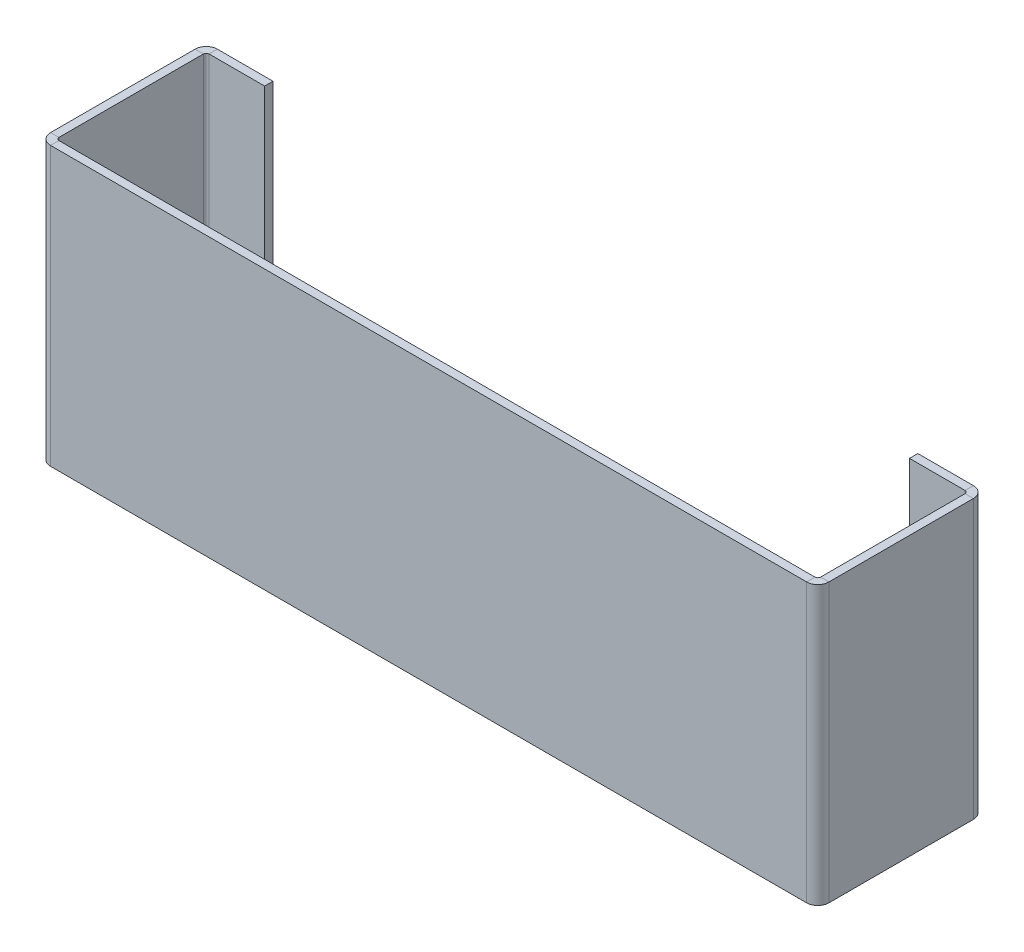
ISO-10303-21;
HEADER;
FILE_DESCRIPTION(('STEP AP214'),'2;1');
FILE_NAME('part.step','',(''),(''),'','','');
FILE_SCHEMA(('AUTOMOTIVE_DESIGN { 1 0 10303 214 1 1 1 1 }'));
ENDSEC;
DATA;
#1=APPLICATION_CONTEXT('core data for automotive mechanical design processes');
#2=APPLICATION_PROTOCOL_DEFINITION('international standard','automotive_design',2000,#1);
#3=PRODUCT_CONTEXT('',#1,'mechanical');
#4=PRODUCT('Part','Part','',(#3));
#5=PRODUCT_RELATED_PRODUCT_CATEGORY('part','',(#4));
#6=PRODUCT_DEFINITION_FORMATION('','',#4);
#7=PRODUCT_DEFINITION_CONTEXT('part definition',#1,'design');
#8=PRODUCT_DEFINITION('design','',#6,#7);
#9=PRODUCT_DEFINITION_SHAPE('','',#8);
#10=(LENGTH_UNIT() NAMED_UNIT(*) SI_UNIT(.MILLI.,.METRE.));
#11=(NAMED_UNIT(*) PLANE_ANGLE_UNIT() SI_UNIT($,.RADIAN.));
#12=(NAMED_UNIT(*) SI_UNIT($,.STERADIAN.) SOLID_ANGLE_UNIT());
#13=UNCERTAINTY_MEASURE_WITH_UNIT(LENGTH_MEASURE(1.E-05),#10,'distance_accuracy_value','');
#14=(GEOMETRIC_REPRESENTATION_CONTEXT(3) GLOBAL_UNCERTAINTY_ASSIGNED_CONTEXT((#13)) GLOBAL_UNIT_ASSIGNED_CONTEXT((#10,
#11,#12)) REPRESENTATION_CONTEXT('',''));
#15=CARTESIAN_POINT('',(0.,0.,0.));
#16=DIRECTION('',(0.,0.,1.));
#17=DIRECTION('',(1.,0.,0.));
#18=AXIS2_PLACEMENT_3D('',#15,#16,#17);
#19=CARTESIAN_POINT('',(-68.,50.,-30.));
#20=DIRECTION('',(0.,1.,0.));
#21=DIRECTION('',(0.,0.,1.));
#22=AXIS2_PLACEMENT_3D('',#19,#20,#21);
#23=PLANE('',#22);
#24=DIRECTION('',(0.,0.,1.));
#25=VECTOR('',#24,1.);
#26=CARTESIAN_POINT('',(-68.,50.,-30.));
#27=LINE('',#26,#25);
#28=CARTESIAN_POINT('',(-68.,50.,-30.));
#29=VERTEX_POINT('',#28);
#30=CARTESIAN_POINT('',(-68.,50.,-28.5));
#31=VERTEX_POINT('',#30);
#32=EDGE_CURVE('E11',#29,#31,#27,.T.);
#33=ORIENTED_EDGE('',*,*,#32,.F.);
#34=CARTESIAN_POINT('',(-68.,50.,-28.));
#35=DIRECTION('',(0.,-1.,0.));
#36=DIRECTION('',(0.,0.,-1.));
#37=AXIS2_PLACEMENT_3D('',#34,#35,#36);
#38=CIRCLE('',#37,2.);
#39=CARTESIAN_POINT('',(-70.,50.,-28.));
#40=VERTEX_POINT('',#39);
#41=EDGE_CURVE('E364',#29,#40,#38,.F.);
#42=ORIENTED_EDGE('',*,*,#41,.T.);
#43=DIRECTION('',(-1.,0.,0.));
#44=VECTOR('',#43,1.);
#45=CARTESIAN_POINT('',(-68.5,50.,-28.));
#46=LINE('',#45,#44);
#47=CARTESIAN_POINT('',(-68.5,50.,-28.));
#48=VERTEX_POINT('',#47);
#49=EDGE_CURVE('E47',#48,#40,#46,.T.);
#50=ORIENTED_EDGE('',*,*,#49,.F.);
#51=CARTESIAN_POINT('',(-68.,50.,-28.));
#52=DIRECTION('',(0.,1.,0.));
#53=DIRECTION('',(1.,0.,0.));
#54=AXIS2_PLACEMENT_3D('',#51,#52,#53);
#55=CIRCLE('',#54,0.5);
#56=EDGE_CURVE('E439',#31,#48,#55,.T.);
#57=ORIENTED_EDGE('',*,*,#56,.F.);
#58=EDGE_LOOP('',(#33,#42,#50,#57));
#59=FACE_BOUND('',#58,.T.);
#60=ADVANCED_FACE('F39',(#59),#23,.T.);
#61=CARTESIAN_POINT('',(-68.5,50.,-28.));
#62=DIRECTION('',(0.,1.,0.));
#63=DIRECTION('',(0.,0.,1.));
#64=AXIS2_PLACEMENT_3D('',#61,#62,#63);
#65=PLANE('',#64);
#66=DIRECTION('',(-1.,0.,0.));
#67=VECTOR('',#66,1.);
#68=CARTESIAN_POINT('',(-70.,50.,-30.));
#69=LINE('',#68,#67);
#70=CARTESIAN_POINT('',(-58.,50.,-30.));
#71=VERTEX_POINT('',#70);
#72=EDGE_CURVE('E368',#71,#29,#69,.T.);
#73=ORIENTED_EDGE('',*,*,#72,.T.);
#74=ORIENTED_EDGE('',*,*,#32,.T.);
#75=DIRECTION('',(-1.,0.,0.));
#76=VECTOR('',#75,1.);
#77=CARTESIAN_POINT('',(-70.,50.,-28.5));
#78=LINE('',#77,#76);
#79=CARTESIAN_POINT('',(-58.,50.,-28.5));
#80=VERTEX_POINT('',#79);
#81=EDGE_CURVE('E441',#80,#31,#78,.T.);
#82=ORIENTED_EDGE('',*,*,#81,.F.);
#83=DIRECTION('',(0.,0.,1.));
#84=VECTOR('',#83,1.);
#85=CARTESIAN_POINT('',(-58.,50.,-30.));
#86=LINE('',#85,#84);
#87=EDGE_CURVE('E444',#71,#80,#86,.T.);
#88=ORIENTED_EDGE('',*,*,#87,.F.);
#89=EDGE_LOOP('',(#73,#74,#82,#88));
#90=FACE_BOUND('',#89,.T.);
#91=ADVANCED_FACE('F450',(#90),#65,.T.);
#92=CARTESIAN_POINT('',(-70.,0.,-28.));
#93=DIRECTION('',(0.,-1.,0.));
#94=DIRECTION('',(0.,0.,-1.));
#95=AXIS2_PLACEMENT_3D('',#92,#93,#94);
#96=PLANE('',#95);
#97=DIRECTION('',(1.,0.,0.));
#98=VECTOR('',#97,1.);
#99=CARTESIAN_POINT('',(-70.,0.,-28.));
#100=LINE('',#99,#98);
#101=CARTESIAN_POINT('',(-70.,0.,-28.));
#102=VERTEX_POINT('',#101);
#103=CARTESIAN_POINT('',(-68.5,0.,-28.));
#104=VERTEX_POINT('',#103);
#105=EDGE_CURVE('E348',#102,#104,#100,.T.);
#106=ORIENTED_EDGE('',*,*,#105,.F.);
#107=CARTESIAN_POINT('',(-68.,0.,-28.));
#108=DIRECTION('',(0.,-1.,0.));
#109=DIRECTION('',(0.,0.,-1.));
#110=AXIS2_PLACEMENT_3D('',#107,#108,#109);
#111=CIRCLE('',#110,2.);
#112=CARTESIAN_POINT('',(-68.,0.,-30.));
#113=VERTEX_POINT('',#112);
#114=EDGE_CURVE('E264',#113,#102,#111,.F.);
#115=ORIENTED_EDGE('',*,*,#114,.F.);
#116=DIRECTION('',(0.,0.,-1.));
#117=VECTOR('',#116,1.);
#118=CARTESIAN_POINT('',(-68.,0.,-28.5));
#119=LINE('',#118,#117);
#120=CARTESIAN_POINT('',(-68.,0.,-28.5));
#121=VERTEX_POINT('',#120);
#122=EDGE_CURVE('E346',#121,#113,#119,.T.);
#123=ORIENTED_EDGE('',*,*,#122,.F.);
#124=CARTESIAN_POINT('',(-68.,0.,-28.));
#125=DIRECTION('',(0.,1.,0.));
#126=DIRECTION('',(1.,0.,0.));
#127=AXIS2_PLACEMENT_3D('',#124,#125,#126);
#128=CIRCLE('',#127,0.5);
#129=EDGE_CURVE('E252',#121,#104,#128,.T.);
#130=ORIENTED_EDGE('',*,*,#129,.T.);
#131=EDGE_LOOP('',(#106,#115,#123,#130));
#132=FACE_BOUND('',#131,.T.);
#133=ADVANCED_FACE('F457',(#132),#96,.T.);
#134=CARTESIAN_POINT('',(-68.,0.,-28.5));
#135=DIRECTION('',(0.,-1.,0.));
#136=DIRECTION('',(0.,0.,-1.));
#137=AXIS2_PLACEMENT_3D('',#134,#135,#136);
#138=PLANE('',#137);
#139=DIRECTION('',(0.,0.,1.));
#140=VECTOR('',#139,1.);
#141=CARTESIAN_POINT('',(-70.,0.,0.));
#142=LINE('',#141,#140);
#143=CARTESIAN_POINT('',(-70.,0.,-1.99999999999999));
#144=VERTEX_POINT('',#143);
#145=EDGE_CURVE('E267',#102,#144,#142,.T.);
#146=ORIENTED_EDGE('',*,*,#145,.F.);
#147=ORIENTED_EDGE('',*,*,#105,.T.);
#148=DIRECTION('',(0.,0.,1.));
#149=VECTOR('',#148,1.);
#150=CARTESIAN_POINT('',(-68.5,0.,0.));
#151=LINE('',#150,#149);
#152=CARTESIAN_POINT('',(-68.5,0.,-1.99999999999999));
#153=VERTEX_POINT('',#152);
#154=EDGE_CURVE('E249',#104,#153,#151,.T.);
#155=ORIENTED_EDGE('',*,*,#154,.T.);
#156=DIRECTION('',(-1.,0.,0.));
#157=VECTOR('',#156,1.);
#158=CARTESIAN_POINT('',(-68.5,0.,-1.99999999999999));
#159=LINE('',#158,#157);
#160=EDGE_CURVE('E338',#153,#144,#159,.T.);
#161=ORIENTED_EDGE('',*,*,#160,.T.);
#162=EDGE_LOOP('',(#146,#147,#155,#161));
#163=FACE_BOUND('',#162,.T.);
#164=ADVANCED_FACE('F460',(#163),#138,.T.);
#165=CARTESIAN_POINT('',(-70.,50.,-1.99999999999999));
#166=DIRECTION('',(0.,1.,0.));
#167=DIRECTION('',(0.,0.,1.));
#168=AXIS2_PLACEMENT_3D('',#165,#166,#167);
#169=PLANE('',#168);
#170=DIRECTION('',(1.,0.,0.));
#171=VECTOR('',#170,1.);
#172=CARTESIAN_POINT('',(-70.,50.,-1.99999999999999));
#173=LINE('',#172,#171);
#174=CARTESIAN_POINT('',(-70.,50.,-1.99999999999999));
#175=VERTEX_POINT('',#174);
#176=CARTESIAN_POINT('',(-68.5,50.,-1.99999999999999));
#177=VERTEX_POINT('',#176);
#178=EDGE_CURVE('E344',#175,#177,#173,.T.);
#179=ORIENTED_EDGE('',*,*,#178,.F.);
#180=CARTESIAN_POINT('',(-68.,50.,-1.99999999999999));
#181=DIRECTION('',(0.,-1.,0.));
#182=DIRECTION('',(0.,0.,-1.));
#183=AXIS2_PLACEMENT_3D('',#180,#181,#182);
#184=CIRCLE('',#183,2.);
#185=CARTESIAN_POINT('',(-68.,50.,0.));
#186=VERTEX_POINT('',#185);
#187=EDGE_CURVE('E376',#175,#186,#184,.F.);
#188=ORIENTED_EDGE('',*,*,#187,.T.);
#189=DIRECTION('',(0.,0.,1.));
#190=VECTOR('',#189,1.);
#191=CARTESIAN_POINT('',(-68.,50.,-1.49999999999999));
#192=LINE('',#191,#190);
#193=CARTESIAN_POINT('',(-68.,50.,-1.49999999999999));
#194=VERTEX_POINT('',#193);
#195=EDGE_CURVE('E342',#194,#186,#192,.T.);
#196=ORIENTED_EDGE('',*,*,#195,.F.);
#197=CARTESIAN_POINT('',(-68.,50.,-1.99999999999999));
#198=DIRECTION('',(0.,1.,0.));
#199=DIRECTION('',(1.,0.,0.));
#200=AXIS2_PLACEMENT_3D('',#197,#198,#199);
#201=CIRCLE('',#200,0.5);
#202=EDGE_CURVE('E435',#177,#194,#201,.T.);
#203=ORIENTED_EDGE('',*,*,#202,.F.);
#204=EDGE_LOOP('',(#179,#188,#196,#203));
#205=FACE_BOUND('',#204,.T.);
#206=ADVANCED_FACE('F480',(#205),#169,.T.);
#207=CARTESIAN_POINT('',(-68.,50.,-1.49999999999999));
#208=DIRECTION('',(0.,1.,0.));
#209=DIRECTION('',(0.,0.,1.));
#210=AXIS2_PLACEMENT_3D('',#207,#208,#209);
#211=PLANE('',#210);
#212=DIRECTION('',(0.,0.,1.));
#213=VECTOR('',#212,1.);
#214=CARTESIAN_POINT('',(-70.,50.,0.));
#215=LINE('',#214,#213);
#216=EDGE_CURVE('E355',#40,#175,#215,.T.);
#217=ORIENTED_EDGE('',*,*,#216,.T.);
#218=ORIENTED_EDGE('',*,*,#178,.T.);
#219=DIRECTION('',(0.,0.,1.));
#220=VECTOR('',#219,1.);
#221=CARTESIAN_POINT('',(-68.5,50.,0.));
#222=LINE('',#221,#220);
#223=EDGE_CURVE('E358',#48,#177,#222,.T.);
#224=ORIENTED_EDGE('',*,*,#223,.F.);
#225=ORIENTED_EDGE('',*,*,#49,.T.);
#226=EDGE_LOOP('',(#217,#218,#224,#225));
#227=FACE_BOUND('',#226,.T.);
#228=ADVANCED_FACE('F353',(#227),#211,.T.);
#229=CARTESIAN_POINT('',(-68.,0.,0.));
#230=DIRECTION('',(0.,-1.,0.));
#231=DIRECTION('',(0.,0.,-1.));
#232=AXIS2_PLACEMENT_3D('',#229,#230,#231);
#233=PLANE('',#232);
#234=DIRECTION('',(0.,0.,-1.));
#235=VECTOR('',#234,1.);
#236=CARTESIAN_POINT('',(-68.,0.,0.));
#237=LINE('',#236,#235);
#238=CARTESIAN_POINT('',(-68.,0.,0.));
#239=VERTEX_POINT('',#238);
#240=CARTESIAN_POINT('',(-68.,0.,-1.49999999999999));
#241=VERTEX_POINT('',#240);
#242=EDGE_CURVE('E340',#239,#241,#237,.T.);
#243=ORIENTED_EDGE('',*,*,#242,.F.);
#244=CARTESIAN_POINT('',(-68.,0.,-1.99999999999999));
#245=DIRECTION('',(0.,-1.,0.));
#246=DIRECTION('',(0.,0.,-1.));
#247=AXIS2_PLACEMENT_3D('',#244,#245,#246);
#248=CIRCLE('',#247,2.);
#249=EDGE_CURVE('E270',#144,#239,#248,.F.);
#250=ORIENTED_EDGE('',*,*,#249,.F.);
#251=ORIENTED_EDGE('',*,*,#160,.F.);
#252=CARTESIAN_POINT('',(-68.,0.,-1.99999999999999));
#253=DIRECTION('',(0.,1.,0.));
#254=DIRECTION('',(1.,0.,0.));
#255=AXIS2_PLACEMENT_3D('',#252,#253,#254);
#256=CIRCLE('',#255,0.5);
#257=EDGE_CURVE('E246',#153,#241,#256,.T.);
#258=ORIENTED_EDGE('',*,*,#257,.T.);
#259=EDGE_LOOP('',(#243,#250,#251,#258));
#260=FACE_BOUND('',#259,.T.);
#261=ADVANCED_FACE('F474',(#260),#233,.T.);
#262=CARTESIAN_POINT('',(-68.5,0.,-1.99999999999999));
#263=DIRECTION('',(0.,-1.,0.));
#264=DIRECTION('',(0.,0.,-1.));
#265=AXIS2_PLACEMENT_3D('',#262,#263,#264);
#266=PLANE('',#265);
#267=DIRECTION('',(1.,0.,0.));
#268=VECTOR('',#267,1.);
#269=CARTESIAN_POINT('',(70.,0.,0.));
#270=LINE('',#269,#268);
#271=CARTESIAN_POINT('',(68.,0.,0.));
#272=VERTEX_POINT('',#271);
#273=EDGE_CURVE('E273',#239,#272,#270,.T.);
#274=ORIENTED_EDGE('',*,*,#273,.F.);
#275=ORIENTED_EDGE('',*,*,#242,.T.);
#276=DIRECTION('',(1.,0.,0.));
#277=VECTOR('',#276,1.);
#278=CARTESIAN_POINT('',(70.,0.,-1.50000000000003));
#279=LINE('',#278,#277);
#280=CARTESIAN_POINT('',(68.,0.,-1.50000000000003));
#281=VERTEX_POINT('',#280);
#282=EDGE_CURVE('E243',#241,#281,#279,.T.);
#283=ORIENTED_EDGE('',*,*,#282,.T.);
#284=DIRECTION('',(0.,0.,1.));
#285=VECTOR('',#284,1.);
#286=CARTESIAN_POINT('',(68.,0.,-1.50000000000003));
#287=LINE('',#286,#285);
#288=EDGE_CURVE('E334',#281,#272,#287,.T.);
#289=ORIENTED_EDGE('',*,*,#288,.T.);
#290=EDGE_LOOP('',(#274,#275,#283,#289));
#291=FACE_BOUND('',#290,.T.);
#292=ADVANCED_FACE('F484',(#291),#266,.T.);
#293=CARTESIAN_POINT('',(68.,50.,0.));
#294=DIRECTION('',(0.,1.,0.));
#295=DIRECTION('',(0.,0.,1.));
#296=AXIS2_PLACEMENT_3D('',#293,#294,#295);
#297=PLANE('',#296);
#298=DIRECTION('',(0.,0.,-1.));
#299=VECTOR('',#298,1.);
#300=CARTESIAN_POINT('',(68.,50.,0.));
#301=LINE('',#300,#299);
#302=CARTESIAN_POINT('',(68.,50.,0.));
#303=VERTEX_POINT('',#302);
#304=CARTESIAN_POINT('',(68.,50.,-1.50000000000003));
#305=VERTEX_POINT('',#304);
#306=EDGE_CURVE('E196',#303,#305,#301,.T.);
#307=ORIENTED_EDGE('',*,*,#306,.F.);
#308=CARTESIAN_POINT('',(68.,50.,-2.00000000000003));
#309=DIRECTION('',(0.,-1.,0.));
#310=DIRECTION('',(0.,0.,-1.));
#311=AXIS2_PLACEMENT_3D('',#308,#309,#310);
#312=CIRCLE('',#311,2.);
#313=CARTESIAN_POINT('',(70.,50.,-2.00000000000003));
#314=VERTEX_POINT('',#313);
#315=EDGE_CURVE('E200',#303,#314,#312,.F.);
#316=ORIENTED_EDGE('',*,*,#315,.T.);
#317=DIRECTION('',(1.,0.,0.));
#318=VECTOR('',#317,1.);
#319=CARTESIAN_POINT('',(68.5,50.,-2.00000000000003));
#320=LINE('',#319,#318);
#321=CARTESIAN_POINT('',(68.5,50.,-2.00000000000003));
#322=VERTEX_POINT('',#321);
#323=EDGE_CURVE('E184',#322,#314,#320,.T.);
#324=ORIENTED_EDGE('',*,*,#323,.F.);
#325=CARTESIAN_POINT('',(68.,50.,-2.00000000000003));
#326=DIRECTION('',(0.,1.,0.));
#327=DIRECTION('',(1.,0.,0.));
#328=AXIS2_PLACEMENT_3D('',#325,#326,#327);
#329=CIRCLE('',#328,0.5);
#330=EDGE_CURVE('E397',#305,#322,#329,.T.);
#331=ORIENTED_EDGE('',*,*,#330,.F.);
#332=EDGE_LOOP('',(#307,#316,#324,#331));
#333=FACE_BOUND('',#332,.T.);
#334=ADVANCED_FACE('F202',(#333),#297,.T.);
#335=CARTESIAN_POINT('',(68.5,50.,-2.00000000000003));
#336=DIRECTION('',(0.,1.,0.));
#337=DIRECTION('',(0.,0.,1.));
#338=AXIS2_PLACEMENT_3D('',#335,#336,#337);
#339=PLANE('',#338);
#340=DIRECTION('',(1.,0.,0.));
#341=VECTOR('',#340,1.);
#342=CARTESIAN_POINT('',(70.,50.,0.));
#343=LINE('',#342,#341);
#344=EDGE_CURVE('E206',#186,#303,#343,.T.);
#345=ORIENTED_EDGE('',*,*,#344,.T.);
#346=ORIENTED_EDGE('',*,*,#306,.T.);
#347=DIRECTION('',(1.,0.,0.));
#348=VECTOR('',#347,1.);
#349=CARTESIAN_POINT('',(70.,50.,-1.50000000000003));
#350=LINE('',#349,#348);
#351=EDGE_CURVE('E432',#194,#305,#350,.T.);
#352=ORIENTED_EDGE('',*,*,#351,.F.);
#353=ORIENTED_EDGE('',*,*,#195,.T.);
#354=EDGE_LOOP('',(#345,#346,#352,#353));
#355=FACE_BOUND('',#354,.T.);
#356=ADVANCED_FACE('F384',(#355),#339,.T.);
#357=CARTESIAN_POINT('',(70.,0.,-2.00000000000003));
#358=DIRECTION('',(0.,-1.,0.));
#359=DIRECTION('',(0.,0.,-1.));
#360=AXIS2_PLACEMENT_3D('',#357,#358,#359);
#361=PLANE('',#360);
#362=DIRECTION('',(-1.,0.,0.));
#363=VECTOR('',#362,1.);
#364=CARTESIAN_POINT('',(70.,0.,-2.00000000000003));
#365=LINE('',#364,#363);
#366=CARTESIAN_POINT('',(70.,0.,-2.00000000000003));
#367=VERTEX_POINT('',#366);
#368=CARTESIAN_POINT('',(68.5,0.,-2.00000000000003));
#369=VERTEX_POINT('',#368);
#370=EDGE_CURVE('E197',#367,#369,#365,.T.);
#371=ORIENTED_EDGE('',*,*,#370,.F.);
#372=CARTESIAN_POINT('',(68.,0.,-2.00000000000003));
#373=DIRECTION('',(0.,-1.,0.));
#374=DIRECTION('',(0.,0.,-1.));
#375=AXIS2_PLACEMENT_3D('',#372,#373,#374);
#376=CIRCLE('',#375,2.);
#377=EDGE_CURVE('E213',#272,#367,#376,.F.);
#378=ORIENTED_EDGE('',*,*,#377,.F.);
#379=ORIENTED_EDGE('',*,*,#288,.F.);
#380=CARTESIAN_POINT('',(68.,0.,-2.00000000000003));
#381=DIRECTION('',(0.,1.,0.));
#382=DIRECTION('',(1.,0.,0.));
#383=AXIS2_PLACEMENT_3D('',#380,#381,#382);
#384=CIRCLE('',#383,0.5);
#385=EDGE_CURVE('E240',#281,#369,#384,.T.);
#386=ORIENTED_EDGE('',*,*,#385,.T.);
#387=EDGE_LOOP('',(#371,#378,#379,#386));
#388=FACE_BOUND('',#387,.T.);
#389=ADVANCED_FACE('F391',(#388),#361,.T.);
#390=CARTESIAN_POINT('',(68.,0.,-1.50000000000003));
#391=DIRECTION('',(0.,-1.,0.));
#392=DIRECTION('',(0.,0.,-1.));
#393=AXIS2_PLACEMENT_3D('',#390,#391,#392);
#394=PLANE('',#393);
#395=DIRECTION('',(0.,0.,-1.));
#396=VECTOR('',#395,1.);
#397=CARTESIAN_POINT('',(70.,0.,0.));
#398=LINE('',#397,#396);
#399=CARTESIAN_POINT('',(70.,0.,-28.));
#400=VERTEX_POINT('',#399);
#401=EDGE_CURVE('E277',#367,#400,#398,.T.);
#402=ORIENTED_EDGE('',*,*,#401,.F.);
#403=ORIENTED_EDGE('',*,*,#370,.T.);
#404=DIRECTION('',(0.,0.,-1.));
#405=VECTOR('',#404,1.);
#406=CARTESIAN_POINT('',(68.5,0.,0.));
#407=LINE('',#406,#405);
#408=CARTESIAN_POINT('',(68.5,0.,-28.));
#409=VERTEX_POINT('',#408);
#410=EDGE_CURVE('E238',#369,#409,#407,.T.);
#411=ORIENTED_EDGE('',*,*,#410,.T.);
#412=DIRECTION('',(1.,0.,0.));
#413=VECTOR('',#412,1.);
#414=CARTESIAN_POINT('',(68.5,0.,-28.));
#415=LINE('',#414,#413);
#416=EDGE_CURVE('E120',#409,#400,#415,.T.);
#417=ORIENTED_EDGE('',*,*,#416,.T.);
#418=EDGE_LOOP('',(#402,#403,#411,#417));
#419=FACE_BOUND('',#418,.T.);
#420=ADVANCED_FACE('F393',(#419),#394,.T.);
#421=CARTESIAN_POINT('',(70.,50.,-28.));
#422=DIRECTION('',(0.,1.,0.));
#423=DIRECTION('',(0.,0.,1.));
#424=AXIS2_PLACEMENT_3D('',#421,#422,#423);
#425=PLANE('',#424);
#426=DIRECTION('',(-1.,0.,0.));
#427=VECTOR('',#426,1.);
#428=CARTESIAN_POINT('',(70.,50.,-28.));
#429=LINE('',#428,#427);
#430=CARTESIAN_POINT('',(70.,50.,-28.));
#431=VERTEX_POINT('',#430);
#432=CARTESIAN_POINT('',(68.5,50.,-28.));
#433=VERTEX_POINT('',#432);
#434=EDGE_CURVE('E332',#431,#433,#429,.T.);
#435=ORIENTED_EDGE('',*,*,#434,.F.);
#436=CARTESIAN_POINT('',(68.,50.,-28.));
#437=DIRECTION('',(0.,-1.,0.));
#438=DIRECTION('',(0.,0.,-1.));
#439=AXIS2_PLACEMENT_3D('',#436,#437,#438);
#440=CIRCLE('',#439,2.);
#441=CARTESIAN_POINT('',(68.,50.,-30.));
#442=VERTEX_POINT('',#441);
#443=EDGE_CURVE('E221',#431,#442,#440,.F.);
#444=ORIENTED_EDGE('',*,*,#443,.T.);
#445=DIRECTION('',(0.,0.,-1.));
#446=VECTOR('',#445,1.);
#447=CARTESIAN_POINT('',(68.,50.,-28.5));
#448=LINE('',#447,#446);
#449=CARTESIAN_POINT('',(68.,50.,-28.5));
#450=VERTEX_POINT('',#449);
#451=EDGE_CURVE('E55',#450,#442,#448,.T.);
#452=ORIENTED_EDGE('',*,*,#451,.F.);
#453=CARTESIAN_POINT('',(68.,50.,-28.));
#454=DIRECTION('',(0.,1.,0.));
#455=DIRECTION('',(1.,0.,0.));
#456=AXIS2_PLACEMENT_3D('',#453,#454,#455);
#457=CIRCLE('',#456,0.5);
#458=EDGE_CURVE('E425',#433,#450,#457,.T.);
#459=ORIENTED_EDGE('',*,*,#458,.F.);
#460=EDGE_LOOP('',(#435,#444,#452,#459));
#461=FACE_BOUND('',#460,.T.);
#462=ADVANCED_FACE('F555',(#461),#425,.T.);
#463=CARTESIAN_POINT('',(68.,50.,-28.5));
#464=DIRECTION('',(0.,1.,0.));
#465=DIRECTION('',(0.,0.,1.));
#466=AXIS2_PLACEMENT_3D('',#463,#464,#465);
#467=PLANE('',#466);
#468=DIRECTION('',(0.,0.,-1.));
#469=VECTOR('',#468,1.);
#470=CARTESIAN_POINT('',(70.,50.,0.));
#471=LINE('',#470,#469);
#472=EDGE_CURVE('E188',#314,#431,#471,.T.);
#473=ORIENTED_EDGE('',*,*,#472,.T.);
#474=ORIENTED_EDGE('',*,*,#434,.T.);
#475=DIRECTION('',(0.,0.,-1.));
#476=VECTOR('',#475,1.);
#477=CARTESIAN_POINT('',(68.5,50.,0.));
#478=LINE('',#477,#476);
#479=EDGE_CURVE('E191',#322,#433,#478,.T.);
#480=ORIENTED_EDGE('',*,*,#479,.F.);
#481=ORIENTED_EDGE('',*,*,#323,.T.);
#482=EDGE_LOOP('',(#473,#474,#480,#481));
#483=FACE_BOUND('',#482,.T.);
#484=ADVANCED_FACE('F186',(#483),#467,.T.);
#485=CARTESIAN_POINT('',(68.,0.,-30.));
#486=DIRECTION('',(0.,-1.,0.));
#487=DIRECTION('',(0.,0.,-1.));
#488=AXIS2_PLACEMENT_3D('',#485,#486,#487);
#489=PLANE('',#488);
#490=DIRECTION('',(0.,0.,1.));
#491=VECTOR('',#490,1.);
#492=CARTESIAN_POINT('',(68.,0.,-30.));
#493=LINE('',#492,#491);
#494=CARTESIAN_POINT('',(68.,0.,-30.));
#495=VERTEX_POINT('',#494);
#496=CARTESIAN_POINT('',(68.,0.,-28.5));
#497=VERTEX_POINT('',#496);
#498=EDGE_CURVE('E127',#495,#497,#493,.T.);
#499=ORIENTED_EDGE('',*,*,#498,.F.);
#500=CARTESIAN_POINT('',(68.,0.,-28.));
#501=DIRECTION('',(0.,-1.,0.));
#502=DIRECTION('',(0.,0.,-1.));
#503=AXIS2_PLACEMENT_3D('',#500,#501,#502);
#504=CIRCLE('',#503,2.);
#505=EDGE_CURVE('E279',#400,#495,#504,.F.);
#506=ORIENTED_EDGE('',*,*,#505,.F.);
#507=ORIENTED_EDGE('',*,*,#416,.F.);
#508=CARTESIAN_POINT('',(68.,0.,-28.));
#509=DIRECTION('',(0.,1.,0.));
#510=DIRECTION('',(1.,0.,0.));
#511=AXIS2_PLACEMENT_3D('',#508,#509,#510);
#512=CIRCLE('',#511,0.5);
#513=EDGE_CURVE('E236',#409,#497,#512,.T.);
#514=ORIENTED_EDGE('',*,*,#513,.T.);
#515=EDGE_LOOP('',(#499,#506,#507,#514));
#516=FACE_BOUND('',#515,.T.);
#517=ADVANCED_FACE('F408',(#516),#489,.T.);
#518=CARTESIAN_POINT('',(68.5,0.,-28.));
#519=DIRECTION('',(0.,-1.,0.));
#520=DIRECTION('',(0.,0.,-1.));
#521=AXIS2_PLACEMENT_3D('',#518,#519,#520);
#522=PLANE('',#521);
#523=DIRECTION('',(-1.,0.,0.));
#524=VECTOR('',#523,1.);
#525=CARTESIAN_POINT('',(70.,0.,-30.));
#526=LINE('',#525,#524);
#527=CARTESIAN_POINT('',(58.,0.,-30.));
#528=VERTEX_POINT('',#527);
#529=EDGE_CURVE('E227',#495,#528,#526,.T.);
#530=ORIENTED_EDGE('',*,*,#529,.F.);
#531=ORIENTED_EDGE('',*,*,#498,.T.);
#532=DIRECTION('',(-1.,0.,0.));
#533=VECTOR('',#532,1.);
#534=CARTESIAN_POINT('',(70.,0.,-28.5));
#535=LINE('',#534,#533);
#536=CARTESIAN_POINT('',(58.,0.,-28.5));
#537=VERTEX_POINT('',#536);
#538=EDGE_CURVE('E233',#497,#537,#535,.T.);
#539=ORIENTED_EDGE('',*,*,#538,.T.);
#540=DIRECTION('',(0.,0.,-1.));
#541=VECTOR('',#540,1.);
#542=CARTESIAN_POINT('',(58.,0.,-28.5));
#543=LINE('',#542,#541);
#544=EDGE_CURVE('E230',#537,#528,#543,.T.);
#545=ORIENTED_EDGE('',*,*,#544,.T.);
#546=EDGE_LOOP('',(#530,#531,#539,#545));
#547=FACE_BOUND('',#546,.T.);
#548=ADVANCED_FACE('F416',(#547),#522,.T.);
#549=CARTESIAN_POINT('',(70.,50.,-30.));
#550=DIRECTION('',(0.,0.,1.));
#551=DIRECTION('',(1.,0.,0.));
#552=AXIS2_PLACEMENT_3D('',#549,#550,#551);
#553=PLANE('',#552);
#554=ORIENTED_EDGE('',*,*,#529,.T.);
#555=DIRECTION('',(0.,-1.,0.));
#556=VECTOR('',#555,1.);
#557=CARTESIAN_POINT('',(58.,50.,-30.));
#558=LINE('',#557,#556);
#559=CARTESIAN_POINT('',(58.,50.,-30.));
#560=VERTEX_POINT('',#559);
#561=EDGE_CURVE('E327',#560,#528,#558,.T.);
#562=ORIENTED_EDGE('',*,*,#561,.F.);
#563=DIRECTION('',(-1.,0.,0.));
#564=VECTOR('',#563,1.);
#565=CARTESIAN_POINT('',(70.,50.,-30.));
#566=LINE('',#565,#564);
#567=EDGE_CURVE('E133',#442,#560,#566,.T.);
#568=ORIENTED_EDGE('',*,*,#567,.F.);
#569=DIRECTION('',(0.,-1.,0.));
#570=VECTOR('',#569,1.);
#571=CARTESIAN_POINT('',(68.,50.,-30.));
#572=LINE('',#571,#570);
#573=EDGE_CURVE('E223',#442,#495,#572,.T.);
#574=ORIENTED_EDGE('',*,*,#573,.T.);
#575=EDGE_LOOP('',(#554,#562,#568,#574));
#576=FACE_BOUND('',#575,.T.);
#577=ADVANCED_FACE('F414',(#576),#553,.F.);
#578=CARTESIAN_POINT('',(58.,50.,-28.5));
#579=DIRECTION('',(-1.,0.,0.));
#580=DIRECTION('',(0.,0.,1.));
#581=AXIS2_PLACEMENT_3D('',#578,#579,#580);
#582=PLANE('',#581);
#583=ORIENTED_EDGE('',*,*,#544,.F.);
#584=DIRECTION('',(0.,-1.,0.));
#585=VECTOR('',#584,1.);
#586=CARTESIAN_POINT('',(58.,50.,-28.5));
#587=LINE('',#586,#585);
#588=CARTESIAN_POINT('',(58.,50.,-28.5));
#589=VERTEX_POINT('',#588);
#590=EDGE_CURVE('E325',#589,#537,#587,.T.);
#591=ORIENTED_EDGE('',*,*,#590,.F.);
#592=DIRECTION('',(0.,0.,-1.));
#593=VECTOR('',#592,1.);
#594=CARTESIAN_POINT('',(58.,50.,-28.5));
#595=LINE('',#594,#593);
#596=EDGE_CURVE('E421',#589,#560,#595,.T.);
#597=ORIENTED_EDGE('',*,*,#596,.T.);
#598=ORIENTED_EDGE('',*,*,#561,.T.);
#599=EDGE_LOOP('',(#583,#591,#597,#598));
#600=FACE_BOUND('',#599,.T.);
#601=ADVANCED_FACE('F419',(#600),#582,.T.);
#602=CARTESIAN_POINT('',(70.,50.,-28.5));
#603=DIRECTION('',(0.,0.,1.));
#604=DIRECTION('',(1.,0.,0.));
#605=AXIS2_PLACEMENT_3D('',#602,#603,#604);
#606=PLANE('',#605);
#607=ORIENTED_EDGE('',*,*,#538,.F.);
#608=DIRECTION('',(0.,-1.,0.));
#609=VECTOR('',#608,1.);
#610=CARTESIAN_POINT('',(68.,50.,-28.5));
#611=LINE('',#610,#609);
#612=EDGE_CURVE('E322',#450,#497,#611,.T.);
#613=ORIENTED_EDGE('',*,*,#612,.F.);
#614=DIRECTION('',(-1.,0.,0.));
#615=VECTOR('',#614,1.);
#616=CARTESIAN_POINT('',(70.,50.,-28.5));
#617=LINE('',#616,#615);
#618=EDGE_CURVE('E423',#450,#589,#617,.T.);
#619=ORIENTED_EDGE('',*,*,#618,.T.);
#620=ORIENTED_EDGE('',*,*,#590,.T.);
#621=EDGE_LOOP('',(#607,#613,#619,#620));
#622=FACE_BOUND('',#621,.T.);
#623=ADVANCED_FACE('F611',(#622),#606,.T.);
#624=CARTESIAN_POINT('',(68.,50.,-28.));
#625=DIRECTION('',(0.,-1.,0.));
#626=DIRECTION('',(0.,0.,-1.));
#627=AXIS2_PLACEMENT_3D('',#624,#625,#626);
#628=CYLINDRICAL_SURFACE('',#627,0.5);
#629=ORIENTED_EDGE('',*,*,#513,.F.);
#630=DIRECTION('',(0.,-1.,0.));
#631=VECTOR('',#630,1.);
#632=CARTESIAN_POINT('',(68.5,50.,-28.));
#633=LINE('',#632,#631);
#634=EDGE_CURVE('E319',#433,#409,#633,.T.);
#635=ORIENTED_EDGE('',*,*,#634,.F.);
#636=ORIENTED_EDGE('',*,*,#458,.T.);
#637=ORIENTED_EDGE('',*,*,#612,.T.);
#638=EDGE_LOOP('',(#629,#635,#636,#637));
#639=FACE_BOUND('',#638,.T.);
#640=ADVANCED_FACE('F405',(#639),#628,.F.);
#641=CARTESIAN_POINT('',(68.5,50.,0.));
#642=DIRECTION('',(-1.,0.,0.));
#643=DIRECTION('',(0.,0.,1.));
#644=AXIS2_PLACEMENT_3D('',#641,#642,#643);
#645=PLANE('',#644);
#646=ORIENTED_EDGE('',*,*,#410,.F.);
#647=DIRECTION('',(0.,-1.,0.));
#648=VECTOR('',#647,1.);
#649=CARTESIAN_POINT('',(68.5,50.,-2.00000000000003));
#650=LINE('',#649,#648);
#651=EDGE_CURVE('E316',#322,#369,#650,.T.);
#652=ORIENTED_EDGE('',*,*,#651,.F.);
#653=ORIENTED_EDGE('',*,*,#479,.T.);
#654=ORIENTED_EDGE('',*,*,#634,.T.);
#655=EDGE_LOOP('',(#646,#652,#653,#654));
#656=FACE_BOUND('',#655,.T.);
#657=ADVANCED_FACE('F399',(#656),#645,.T.);
#658=CARTESIAN_POINT('',(68.,50.,-2.00000000000003));
#659=DIRECTION('',(0.,-1.,0.));
#660=DIRECTION('',(0.,0.,-1.));
#661=AXIS2_PLACEMENT_3D('',#658,#659,#660);
#662=CYLINDRICAL_SURFACE('',#661,0.5);
#663=ORIENTED_EDGE('',*,*,#385,.F.);
#664=DIRECTION('',(0.,-1.,0.));
#665=VECTOR('',#664,1.);
#666=CARTESIAN_POINT('',(68.,50.,-1.50000000000003));
#667=LINE('',#666,#665);
#668=EDGE_CURVE('E313',#305,#281,#667,.T.);
#669=ORIENTED_EDGE('',*,*,#668,.F.);
#670=ORIENTED_EDGE('',*,*,#330,.T.);
#671=ORIENTED_EDGE('',*,*,#651,.T.);
#672=EDGE_LOOP('',(#663,#669,#670,#671));
#673=FACE_BOUND('',#672,.T.);
#674=ADVANCED_FACE('F396',(#673),#662,.F.);
#675=CARTESIAN_POINT('',(70.,50.,-1.50000000000003));
#676=DIRECTION('',(0.,0.,-1.));
#677=DIRECTION('',(-1.,0.,0.));
#678=AXIS2_PLACEMENT_3D('',#675,#676,#677);
#679=PLANE('',#678);
#680=ORIENTED_EDGE('',*,*,#282,.F.);
#681=DIRECTION('',(0.,-1.,0.));
#682=VECTOR('',#681,1.);
#683=CARTESIAN_POINT('',(-68.,50.,-1.49999999999999));
#684=LINE('',#683,#682);
#685=EDGE_CURVE('E310',#194,#241,#684,.T.);
#686=ORIENTED_EDGE('',*,*,#685,.F.);
#687=ORIENTED_EDGE('',*,*,#351,.T.);
#688=ORIENTED_EDGE('',*,*,#668,.T.);
#689=EDGE_LOOP('',(#680,#686,#687,#688));
#690=FACE_BOUND('',#689,.T.);
#691=ADVANCED_FACE('F482',(#690),#679,.T.);
#692=CARTESIAN_POINT('',(-68.,50.,-1.99999999999999));
#693=DIRECTION('',(0.,-1.,0.));
#694=DIRECTION('',(0.,0.,-1.));
#695=AXIS2_PLACEMENT_3D('',#692,#693,#694);
#696=CYLINDRICAL_SURFACE('',#695,0.5);
#697=ORIENTED_EDGE('',*,*,#257,.F.);
#698=DIRECTION('',(0.,-1.,0.));
#699=VECTOR('',#698,1.);
#700=CARTESIAN_POINT('',(-68.5,50.,-1.99999999999999));
#701=LINE('',#700,#699);
#702=EDGE_CURVE('E307',#177,#153,#701,.T.);
#703=ORIENTED_EDGE('',*,*,#702,.F.);
#704=ORIENTED_EDGE('',*,*,#202,.T.);
#705=ORIENTED_EDGE('',*,*,#685,.T.);
#706=EDGE_LOOP('',(#697,#703,#704,#705));
#707=FACE_BOUND('',#706,.T.);
#708=ADVANCED_FACE('F470',(#707),#696,.F.);
#709=CARTESIAN_POINT('',(-68.5,50.,0.));
#710=DIRECTION('',(1.,0.,0.));
#711=DIRECTION('',(0.,0.,-1.));
#712=AXIS2_PLACEMENT_3D('',#709,#710,#711);
#713=PLANE('',#712);
#714=ORIENTED_EDGE('',*,*,#154,.F.);
#715=DIRECTION('',(0.,-1.,0.));
#716=VECTOR('',#715,1.);
#717=CARTESIAN_POINT('',(-68.5,50.,-28.));
#718=LINE('',#717,#716);
#719=EDGE_CURVE('E304',#48,#104,#718,.T.);
#720=ORIENTED_EDGE('',*,*,#719,.F.);
#721=ORIENTED_EDGE('',*,*,#223,.T.);
#722=ORIENTED_EDGE('',*,*,#702,.T.);
#723=EDGE_LOOP('',(#714,#720,#721,#722));
#724=FACE_BOUND('',#723,.T.);
#725=ADVANCED_FACE('F465',(#724),#713,.T.);
#726=CARTESIAN_POINT('',(-68.,50.,-28.));
#727=DIRECTION('',(0.,-1.,0.));
#728=DIRECTION('',(0.,0.,-1.));
#729=AXIS2_PLACEMENT_3D('',#726,#727,#728);
#730=CYLINDRICAL_SURFACE('',#729,0.5);
#731=ORIENTED_EDGE('',*,*,#129,.F.);
#732=DIRECTION('',(0.,-1.,0.));
#733=VECTOR('',#732,1.);
#734=CARTESIAN_POINT('',(-68.,50.,-28.5));
#735=LINE('',#734,#733);
#736=EDGE_CURVE('E301',#31,#121,#735,.T.);
#737=ORIENTED_EDGE('',*,*,#736,.F.);
#738=ORIENTED_EDGE('',*,*,#56,.T.);
#739=ORIENTED_EDGE('',*,*,#719,.T.);
#740=EDGE_LOOP('',(#731,#737,#738,#739));
#741=FACE_BOUND('',#740,.T.);
#742=ADVANCED_FACE('F463',(#741),#730,.F.);
#743=CARTESIAN_POINT('',(-70.,50.,-28.5));
#744=DIRECTION('',(0.,0.,1.));
#745=DIRECTION('',(1.,0.,0.));
#746=AXIS2_PLACEMENT_3D('',#743,#744,#745);
#747=PLANE('',#746);
#748=DIRECTION('',(-1.,0.,0.));
#749=VECTOR('',#748,1.);
#750=CARTESIAN_POINT('',(-70.,0.,-28.5));
#751=LINE('',#750,#749);
#752=CARTESIAN_POINT('',(-58.,0.,-28.5));
#753=VERTEX_POINT('',#752);
#754=EDGE_CURVE('E255',#753,#121,#751,.T.);
#755=ORIENTED_EDGE('',*,*,#754,.F.);
#756=DIRECTION('',(0.,-1.,0.));
#757=VECTOR('',#756,1.);
#758=CARTESIAN_POINT('',(-58.,50.,-28.5));
#759=LINE('',#758,#757);
#760=EDGE_CURVE('E299',#80,#753,#759,.T.);
#761=ORIENTED_EDGE('',*,*,#760,.F.);
#762=ORIENTED_EDGE('',*,*,#81,.T.);
#763=ORIENTED_EDGE('',*,*,#736,.T.);
#764=EDGE_LOOP('',(#755,#761,#762,#763));
#765=FACE_BOUND('',#764,.T.);
#766=ADVANCED_FACE('F685',(#765),#747,.T.);
#767=CARTESIAN_POINT('',(-58.,50.,-30.));
#768=DIRECTION('',(1.,0.,0.));
#769=DIRECTION('',(0.,0.,-1.));
#770=AXIS2_PLACEMENT_3D('',#767,#768,#769);
#771=PLANE('',#770);
#772=DIRECTION('',(0.,0.,1.));
#773=VECTOR('',#772,1.);
#774=CARTESIAN_POINT('',(-58.,0.,-30.));
#775=LINE('',#774,#773);
#776=CARTESIAN_POINT('',(-58.,0.,-30.));
#777=VERTEX_POINT('',#776);
#778=EDGE_CURVE('E258',#777,#753,#775,.T.);
#779=ORIENTED_EDGE('',*,*,#778,.F.);
#780=DIRECTION('',(0.,-1.,0.));
#781=VECTOR('',#780,1.);
#782=CARTESIAN_POINT('',(-58.,50.,-30.));
#783=LINE('',#782,#781);
#784=EDGE_CURVE('E297',#71,#777,#783,.T.);
#785=ORIENTED_EDGE('',*,*,#784,.F.);
#786=ORIENTED_EDGE('',*,*,#87,.T.);
#787=ORIENTED_EDGE('',*,*,#760,.T.);
#788=EDGE_LOOP('',(#779,#785,#786,#787));
#789=FACE_BOUND('',#788,.T.);
#790=ADVANCED_FACE('F695',(#789),#771,.T.);
#791=CARTESIAN_POINT('',(-70.,50.,-30.));
#792=DIRECTION('',(0.,0.,1.));
#793=DIRECTION('',(1.,0.,0.));
#794=AXIS2_PLACEMENT_3D('',#791,#792,#793);
#795=PLANE('',#794);
#796=DIRECTION('',(-1.,0.,0.));
#797=VECTOR('',#796,1.);
#798=CARTESIAN_POINT('',(-70.,0.,-30.));
#799=LINE('',#798,#797);
#800=EDGE_CURVE('E261',#777,#113,#799,.T.);
#801=ORIENTED_EDGE('',*,*,#800,.T.);
#802=DIRECTION('',(0.,-1.,0.));
#803=VECTOR('',#802,1.);
#804=CARTESIAN_POINT('',(-68.,50.,-30.));
#805=LINE('',#804,#803);
#806=EDGE_CURVE('E294',#29,#113,#805,.T.);
#807=ORIENTED_EDGE('',*,*,#806,.F.);
#808=ORIENTED_EDGE('',*,*,#72,.F.);
#809=ORIENTED_EDGE('',*,*,#784,.T.);
#810=EDGE_LOOP('',(#801,#807,#808,#809));
#811=FACE_BOUND('',#810,.T.);
#812=ADVANCED_FACE('F454',(#811),#795,.F.);
#813=CARTESIAN_POINT('',(-68.,50.,-28.));
#814=DIRECTION('',(0.,-1.,0.));
#815=DIRECTION('',(0.,0.,-1.));
#816=AXIS2_PLACEMENT_3D('',#813,#814,#815);
#817=CYLINDRICAL_SURFACE('',#816,2.);
#818=ORIENTED_EDGE('',*,*,#114,.T.);
#819=DIRECTION('',(0.,-1.,0.));
#820=VECTOR('',#819,1.);
#821=CARTESIAN_POINT('',(-70.,50.,-28.));
#822=LINE('',#821,#820);
#823=EDGE_CURVE('E291',#40,#102,#822,.T.);
#824=ORIENTED_EDGE('',*,*,#823,.F.);
#825=ORIENTED_EDGE('',*,*,#41,.F.);
#826=ORIENTED_EDGE('',*,*,#806,.T.);
#827=EDGE_LOOP('',(#818,#824,#825,#826));
#828=FACE_BOUND('',#827,.T.);
#829=ADVANCED_FACE('F370',(#828),#817,.T.);
#830=CARTESIAN_POINT('',(-70.,50.,0.));
#831=DIRECTION('',(1.,0.,0.));
#832=DIRECTION('',(0.,0.,-1.));
#833=AXIS2_PLACEMENT_3D('',#830,#831,#832);
#834=PLANE('',#833);
#835=ORIENTED_EDGE('',*,*,#145,.T.);
#836=DIRECTION('',(0.,-1.,0.));
#837=VECTOR('',#836,1.);
#838=CARTESIAN_POINT('',(-70.,50.,-1.99999999999999));
#839=LINE('',#838,#837);
#840=EDGE_CURVE('E288',#175,#144,#839,.T.);
#841=ORIENTED_EDGE('',*,*,#840,.F.);
#842=ORIENTED_EDGE('',*,*,#216,.F.);
#843=ORIENTED_EDGE('',*,*,#823,.T.);
#844=EDGE_LOOP('',(#835,#841,#842,#843));
#845=FACE_BOUND('',#844,.T.);
#846=ADVANCED_FACE('F374',(#845),#834,.F.);
#847=CARTESIAN_POINT('',(-68.,50.,-1.99999999999999));
#848=DIRECTION('',(0.,-1.,0.));
#849=DIRECTION('',(0.,0.,-1.));
#850=AXIS2_PLACEMENT_3D('',#847,#848,#849);
#851=CYLINDRICAL_SURFACE('',#850,2.);
#852=ORIENTED_EDGE('',*,*,#249,.T.);
#853=DIRECTION('',(0.,-1.,0.));
#854=VECTOR('',#853,1.);
#855=CARTESIAN_POINT('',(-68.,50.,0.));
#856=LINE('',#855,#854);
#857=EDGE_CURVE('E285',#186,#239,#856,.T.);
#858=ORIENTED_EDGE('',*,*,#857,.F.);
#859=ORIENTED_EDGE('',*,*,#187,.F.);
#860=ORIENTED_EDGE('',*,*,#840,.T.);
#861=EDGE_LOOP('',(#852,#858,#859,#860));
#862=FACE_BOUND('',#861,.T.);
#863=ADVANCED_FACE('F477',(#862),#851,.T.);
#864=CARTESIAN_POINT('',(70.,50.,0.));
#865=DIRECTION('',(0.,0.,-1.));
#866=DIRECTION('',(-1.,0.,0.));
#867=AXIS2_PLACEMENT_3D('',#864,#865,#866);
#868=PLANE('',#867);
#869=ORIENTED_EDGE('',*,*,#273,.T.);
#870=DIRECTION('',(0.,-1.,0.));
#871=VECTOR('',#870,1.);
#872=CARTESIAN_POINT('',(68.,50.,0.));
#873=LINE('',#872,#871);
#874=EDGE_CURVE('E215',#303,#272,#873,.T.);
#875=ORIENTED_EDGE('',*,*,#874,.F.);
#876=ORIENTED_EDGE('',*,*,#344,.F.);
#877=ORIENTED_EDGE('',*,*,#857,.T.);
#878=EDGE_LOOP('',(#869,#875,#876,#877));
#879=FACE_BOUND('',#878,.T.);
#880=ADVANCED_FACE('F388',(#879),#868,.F.);
#881=CARTESIAN_POINT('',(68.,50.,-2.00000000000003));
#882=DIRECTION('',(0.,-1.,0.));
#883=DIRECTION('',(0.,0.,-1.));
#884=AXIS2_PLACEMENT_3D('',#881,#882,#883);
#885=CYLINDRICAL_SURFACE('',#884,2.);
#886=ORIENTED_EDGE('',*,*,#377,.T.);
#887=DIRECTION('',(0.,-1.,0.));
#888=VECTOR('',#887,1.);
#889=CARTESIAN_POINT('',(70.,50.,-2.00000000000003));
#890=LINE('',#889,#888);
#891=EDGE_CURVE('E210',#314,#367,#890,.T.);
#892=ORIENTED_EDGE('',*,*,#891,.F.);
#893=ORIENTED_EDGE('',*,*,#315,.F.);
#894=ORIENTED_EDGE('',*,*,#874,.T.);
#895=EDGE_LOOP('',(#886,#892,#893,#894));
#896=FACE_BOUND('',#895,.T.);
#897=ADVANCED_FACE('F211',(#896),#885,.T.);
#898=CARTESIAN_POINT('',(70.,50.,0.));
#899=DIRECTION('',(-1.,0.,0.));
#900=DIRECTION('',(0.,0.,1.));
#901=AXIS2_PLACEMENT_3D('',#898,#899,#900);
#902=PLANE('',#901);
#903=ORIENTED_EDGE('',*,*,#401,.T.);
#904=DIRECTION('',(0.,-1.,0.));
#905=VECTOR('',#904,1.);
#906=CARTESIAN_POINT('',(70.,50.,-28.));
#907=LINE('',#906,#905);
#908=EDGE_CURVE('E216',#431,#400,#907,.T.);
#909=ORIENTED_EDGE('',*,*,#908,.F.);
#910=ORIENTED_EDGE('',*,*,#472,.F.);
#911=ORIENTED_EDGE('',*,*,#891,.T.);
#912=EDGE_LOOP('',(#903,#909,#910,#911));
#913=FACE_BOUND('',#912,.T.);
#914=ADVANCED_FACE('F218',(#913),#902,.F.);
#915=CARTESIAN_POINT('',(68.,50.,-28.));
#916=DIRECTION('',(0.,-1.,0.));
#917=DIRECTION('',(0.,0.,-1.));
#918=AXIS2_PLACEMENT_3D('',#915,#916,#917);
#919=CYLINDRICAL_SURFACE('',#918,2.);
#920=ORIENTED_EDGE('',*,*,#505,.T.);
#921=ORIENTED_EDGE('',*,*,#573,.F.);
#922=ORIENTED_EDGE('',*,*,#443,.F.);
#923=ORIENTED_EDGE('',*,*,#908,.T.);
#924=EDGE_LOOP('',(#920,#921,#922,#923));
#925=FACE_BOUND('',#924,.T.);
#926=ADVANCED_FACE('F411',(#925),#919,.T.);
#927=CARTESIAN_POINT('',(68.,50.,-28.));
#928=DIRECTION('',(0.,1.,0.));
#929=DIRECTION('',(1.,0.,0.));
#930=AXIS2_PLACEMENT_3D('',#927,#928,#929);
#931=PLANE('',#930);
#932=ORIENTED_EDGE('',*,*,#567,.T.);
#933=ORIENTED_EDGE('',*,*,#596,.F.);
#934=ORIENTED_EDGE('',*,*,#618,.F.);
#935=ORIENTED_EDGE('',*,*,#451,.T.);
#936=EDGE_LOOP('',(#932,#933,#934,#935));
#937=FACE_BOUND('',#936,.T.);
#938=ADVANCED_FACE('F779',(#937),#931,.T.);
#939=CARTESIAN_POINT('',(68.,0.,-28.));
#940=DIRECTION('',(0.,1.,0.));
#941=DIRECTION('',(1.,0.,0.));
#942=AXIS2_PLACEMENT_3D('',#939,#940,#941);
#943=PLANE('',#942);
#944=ORIENTED_EDGE('',*,*,#754,.T.);
#945=ORIENTED_EDGE('',*,*,#122,.T.);
#946=ORIENTED_EDGE('',*,*,#800,.F.);
#947=ORIENTED_EDGE('',*,*,#778,.T.);
#948=EDGE_LOOP('',(#944,#945,#946,#947));
#949=FACE_BOUND('',#948,.T.);
#950=ADVANCED_FACE('F789',(#949),#943,.F.);
#951=CLOSED_SHELL('',(#60,#91,#133,#164,#206,#228,#261,#292,#334,#356,#389,#420,#462,#484,#517,
#548,#577,#601,#623,#640,#657,#674,#691,#708,#725,#742,#766,#790,#812,#829,#846,#863,#880,#897,
#914,#926,#938,#950));
#952=MANIFOLD_SOLID_BREP('B2',#951);
#953=ADVANCED_BREP_SHAPE_REPRESENTATION('',(#18,#952),#14);
#954=SHAPE_DEFINITION_REPRESENTATION(#9,#953);
ENDSEC;
END-ISO-10303-21;
